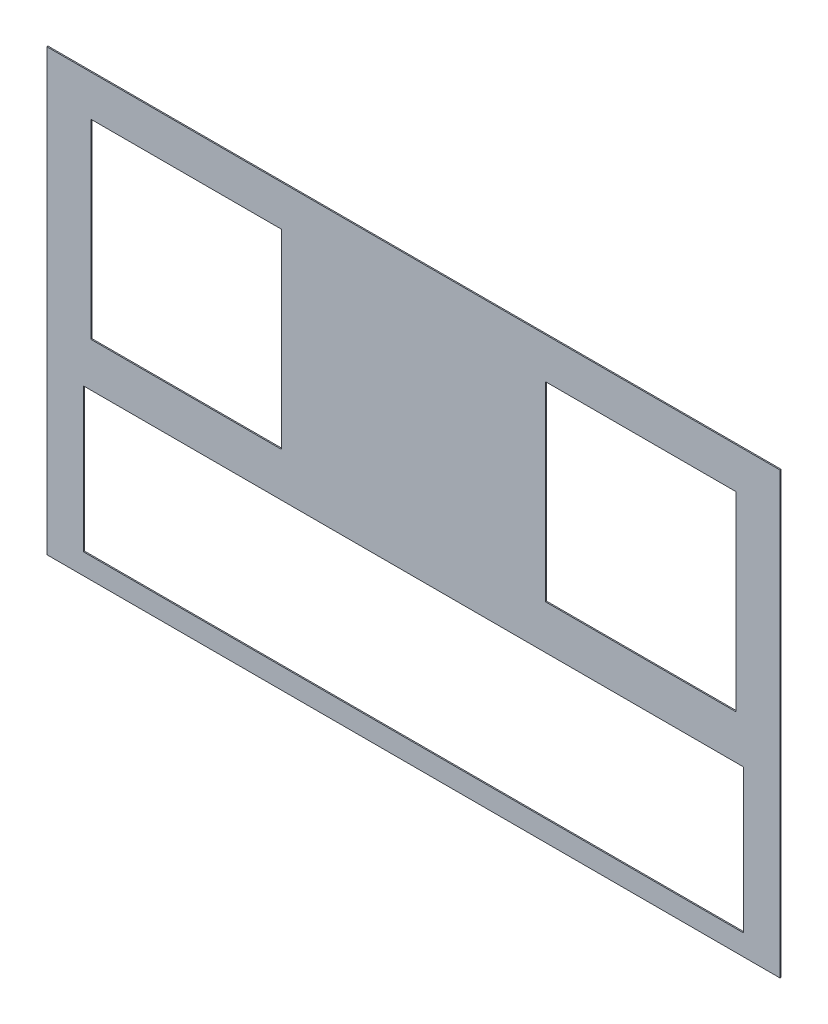
ISO-10303-21;
HEADER;
FILE_DESCRIPTION(('STEP AP214'),'2;1');
FILE_NAME('part.step','',(''),(''),'','','');
FILE_SCHEMA(('AUTOMOTIVE_DESIGN { 1 0 10303 214 1 1 1 1 }'));
ENDSEC;
DATA;
#1=APPLICATION_CONTEXT('core data for automotive mechanical design processes');
#2=APPLICATION_PROTOCOL_DEFINITION('international standard','automotive_design',2000,#1);
#3=PRODUCT_CONTEXT('',#1,'mechanical');
#4=PRODUCT('Part','Part','',(#3));
#5=PRODUCT_RELATED_PRODUCT_CATEGORY('part','',(#4));
#6=PRODUCT_DEFINITION_FORMATION('','',#4);
#7=PRODUCT_DEFINITION_CONTEXT('part definition',#1,'design');
#8=PRODUCT_DEFINITION('design','',#6,#7);
#9=PRODUCT_DEFINITION_SHAPE('','',#8);
#10=(LENGTH_UNIT() NAMED_UNIT(*) SI_UNIT(.MILLI.,.METRE.));
#11=(NAMED_UNIT(*) PLANE_ANGLE_UNIT() SI_UNIT($,.RADIAN.));
#12=(NAMED_UNIT(*) SI_UNIT($,.STERADIAN.) SOLID_ANGLE_UNIT());
#13=UNCERTAINTY_MEASURE_WITH_UNIT(LENGTH_MEASURE(1.E-05),#10,'distance_accuracy_value','');
#14=(GEOMETRIC_REPRESENTATION_CONTEXT(3) GLOBAL_UNCERTAINTY_ASSIGNED_CONTEXT((#13)) GLOBAL_UNIT_ASSIGNED_CONTEXT((#10,
#11,#12)) REPRESENTATION_CONTEXT('',''));
#15=CARTESIAN_POINT('',(0.,0.,0.));
#16=DIRECTION('',(0.,0.,1.));
#17=DIRECTION('',(1.,0.,0.));
#18=AXIS2_PLACEMENT_3D('',#15,#16,#17);
#19=CARTESIAN_POINT('',(-1250.,750.,4.));
#20=DIRECTION('',(1.,0.,0.));
#21=DIRECTION('',(0.,0.,-1.));
#22=AXIS2_PLACEMENT_3D('',#19,#20,#21);
#23=PLANE('',#22);
#24=DIRECTION('',(0.,-1.,0.));
#25=VECTOR('',#24,1.);
#26=CARTESIAN_POINT('',(-1250.,750.,0.));
#27=LINE('',#26,#25);
#28=CARTESIAN_POINT('',(-1250.,750.,0.));
#29=VERTEX_POINT('',#28);
#30=CARTESIAN_POINT('',(-1250.,-750.,0.));
#31=VERTEX_POINT('',#30);
#32=EDGE_CURVE('E240',#29,#31,#27,.T.);
#33=ORIENTED_EDGE('',*,*,#32,.T.);
#34=DIRECTION('',(0.,0.,-1.));
#35=VECTOR('',#34,1.);
#36=CARTESIAN_POINT('',(-1250.,-750.,4.));
#37=LINE('',#36,#35);
#38=CARTESIAN_POINT('',(-1250.,-750.,4.));
#39=VERTEX_POINT('',#38);
#40=EDGE_CURVE('E11',#39,#31,#37,.T.);
#41=ORIENTED_EDGE('',*,*,#40,.F.);
#42=DIRECTION('',(0.,-1.,0.));
#43=VECTOR('',#42,1.);
#44=CARTESIAN_POINT('',(-1250.,750.,4.));
#45=LINE('',#44,#43);
#46=CARTESIAN_POINT('',(-1250.,750.,4.));
#47=VERTEX_POINT('',#46);
#48=EDGE_CURVE('E247',#47,#39,#45,.T.);
#49=ORIENTED_EDGE('',*,*,#48,.F.);
#50=DIRECTION('',(0.,0.,-1.));
#51=VECTOR('',#50,1.);
#52=CARTESIAN_POINT('',(-1250.,750.,4.));
#53=LINE('',#52,#51);
#54=EDGE_CURVE('E257',#47,#29,#53,.T.);
#55=ORIENTED_EDGE('',*,*,#54,.T.);
#56=EDGE_LOOP('',(#33,#41,#49,#55));
#57=FACE_BOUND('',#56,.T.);
#58=ADVANCED_FACE('F34',(#57),#23,.F.);
#59=CARTESIAN_POINT('',(-1250.,-750.,4.));
#60=DIRECTION('',(0.,1.,0.));
#61=DIRECTION('',(0.,0.,1.));
#62=AXIS2_PLACEMENT_3D('',#59,#60,#61);
#63=PLANE('',#62);
#64=DIRECTION('',(1.,0.,0.));
#65=VECTOR('',#64,1.);
#66=CARTESIAN_POINT('',(-1250.,-750.,0.));
#67=LINE('',#66,#65);
#68=CARTESIAN_POINT('',(1250.,-750.,0.));
#69=VERTEX_POINT('',#68);
#70=EDGE_CURVE('E260',#31,#69,#67,.T.);
#71=ORIENTED_EDGE('',*,*,#70,.T.);
#72=DIRECTION('',(0.,0.,-1.));
#73=VECTOR('',#72,1.);
#74=CARTESIAN_POINT('',(1250.,-750.,4.));
#75=LINE('',#74,#73);
#76=CARTESIAN_POINT('',(1250.,-750.,4.));
#77=VERTEX_POINT('',#76);
#78=EDGE_CURVE('E41',#77,#69,#75,.T.);
#79=ORIENTED_EDGE('',*,*,#78,.F.);
#80=DIRECTION('',(1.,0.,0.));
#81=VECTOR('',#80,1.);
#82=CARTESIAN_POINT('',(-1250.,-750.,4.));
#83=LINE('',#82,#81);
#84=EDGE_CURVE('E250',#39,#77,#83,.T.);
#85=ORIENTED_EDGE('',*,*,#84,.F.);
#86=ORIENTED_EDGE('',*,*,#40,.T.);
#87=EDGE_LOOP('',(#71,#79,#85,#86));
#88=FACE_BOUND('',#87,.T.);
#89=ADVANCED_FACE('F289',(#88),#63,.F.);
#90=CARTESIAN_POINT('',(1250.,750.,4.));
#91=DIRECTION('',(-1.,0.,0.));
#92=DIRECTION('',(0.,0.,1.));
#93=AXIS2_PLACEMENT_3D('',#90,#91,#92);
#94=PLANE('',#93);
#95=DIRECTION('',(0.,1.,0.));
#96=VECTOR('',#95,1.);
#97=CARTESIAN_POINT('',(1250.,750.,0.));
#98=LINE('',#97,#96);
#99=CARTESIAN_POINT('',(1250.,750.,0.));
#100=VERTEX_POINT('',#99);
#101=EDGE_CURVE('E262',#69,#100,#98,.T.);
#102=ORIENTED_EDGE('',*,*,#101,.T.);
#103=DIRECTION('',(0.,0.,-1.));
#104=VECTOR('',#103,1.);
#105=CARTESIAN_POINT('',(1250.,750.,4.));
#106=LINE('',#105,#104);
#107=CARTESIAN_POINT('',(1250.,750.,4.));
#108=VERTEX_POINT('',#107);
#109=EDGE_CURVE('E268',#108,#100,#106,.T.);
#110=ORIENTED_EDGE('',*,*,#109,.F.);
#111=DIRECTION('',(0.,1.,0.));
#112=VECTOR('',#111,1.);
#113=CARTESIAN_POINT('',(1250.,750.,4.));
#114=LINE('',#113,#112);
#115=EDGE_CURVE('E253',#77,#108,#114,.T.);
#116=ORIENTED_EDGE('',*,*,#115,.F.);
#117=ORIENTED_EDGE('',*,*,#78,.T.);
#118=EDGE_LOOP('',(#102,#110,#116,#117));
#119=FACE_BOUND('',#118,.T.);
#120=ADVANCED_FACE('F275',(#119),#94,.F.);
#121=CARTESIAN_POINT('',(-1250.,750.,4.));
#122=DIRECTION('',(0.,-1.,0.));
#123=DIRECTION('',(0.,0.,-1.));
#124=AXIS2_PLACEMENT_3D('',#121,#122,#123);
#125=PLANE('',#124);
#126=DIRECTION('',(-1.,0.,0.));
#127=VECTOR('',#126,1.);
#128=CARTESIAN_POINT('',(-1250.,750.,0.));
#129=LINE('',#128,#127);
#130=EDGE_CURVE('E251',#100,#29,#129,.T.);
#131=ORIENTED_EDGE('',*,*,#130,.T.);
#132=ORIENTED_EDGE('',*,*,#54,.F.);
#133=DIRECTION('',(-1.,0.,0.));
#134=VECTOR('',#133,1.);
#135=CARTESIAN_POINT('',(0.,750.,4.));
#136=LINE('',#135,#134);
#137=EDGE_CURVE('E255',#108,#47,#136,.T.);
#138=ORIENTED_EDGE('',*,*,#137,.F.);
#139=ORIENTED_EDGE('',*,*,#109,.T.);
#140=EDGE_LOOP('',(#131,#132,#138,#139));
#141=FACE_BOUND('',#140,.T.);
#142=ADVANCED_FACE('F282',(#141),#125,.F.);
#143=CARTESIAN_POINT('',(0.,0.,4.));
#144=DIRECTION('',(0.,0.,1.));
#145=DIRECTION('',(1.,0.,0.));
#146=AXIS2_PLACEMENT_3D('',#143,#144,#145);
#147=PLANE('',#146);
#148=DIRECTION('',(0.,-1.,0.));
#149=VECTOR('',#148,1.);
#150=CARTESIAN_POINT('',(-1125.,-189.,4.));
#151=LINE('',#150,#149);
#152=CARTESIAN_POINT('',(-1125.,-189.,4.));
#153=VERTEX_POINT('',#152);
#154=CARTESIAN_POINT('',(-1125.,-679.,4.));
#155=VERTEX_POINT('',#154);
#156=EDGE_CURVE('E48',#153,#155,#151,.T.);
#157=ORIENTED_EDGE('',*,*,#156,.F.);
#158=DIRECTION('',(-1.,0.,0.));
#159=VECTOR('',#158,1.);
#160=CARTESIAN_POINT('',(-1125.,-189.,4.));
#161=LINE('',#160,#159);
#162=CARTESIAN_POINT('',(1125.,-189.,4.));
#163=VERTEX_POINT('',#162);
#164=EDGE_CURVE('E164',#163,#153,#161,.T.);
#165=ORIENTED_EDGE('',*,*,#164,.F.);
#166=DIRECTION('',(0.,1.,0.));
#167=VECTOR('',#166,1.);
#168=CARTESIAN_POINT('',(1125.,-189.,4.));
#169=LINE('',#168,#167);
#170=CARTESIAN_POINT('',(1125.,-679.,4.));
#171=VERTEX_POINT('',#170);
#172=EDGE_CURVE('E167',#171,#163,#169,.T.);
#173=ORIENTED_EDGE('',*,*,#172,.F.);
#174=DIRECTION('',(1.,0.,0.));
#175=VECTOR('',#174,1.);
#176=CARTESIAN_POINT('',(-1125.,-679.,4.));
#177=LINE('',#176,#175);
#178=EDGE_CURVE('E173',#155,#171,#177,.T.);
#179=ORIENTED_EDGE('',*,*,#178,.F.);
#180=EDGE_LOOP('',(#157,#165,#173,#179));
#181=FACE_BOUND('',#180,.T.);
#182=DIRECTION('',(0.,-1.,0.));
#183=VECTOR('',#182,1.);
#184=CARTESIAN_POINT('',(450.,611.,4.));
#185=LINE('',#184,#183);
#186=CARTESIAN_POINT('',(450.,611.,4.));
#187=VERTEX_POINT('',#186);
#188=CARTESIAN_POINT('',(450.,-38.9999999999998,4.));
#189=VERTEX_POINT('',#188);
#190=EDGE_CURVE('E179',#187,#189,#185,.T.);
#191=ORIENTED_EDGE('',*,*,#190,.F.);
#192=DIRECTION('',(-1.,0.,0.));
#193=VECTOR('',#192,1.);
#194=CARTESIAN_POINT('',(450.,611.,4.));
#195=LINE('',#194,#193);
#196=CARTESIAN_POINT('',(1100.,611.,4.));
#197=VERTEX_POINT('',#196);
#198=EDGE_CURVE('E187',#197,#187,#195,.T.);
#199=ORIENTED_EDGE('',*,*,#198,.F.);
#200=DIRECTION('',(0.,1.,0.));
#201=VECTOR('',#200,1.);
#202=CARTESIAN_POINT('',(1100.,611.,4.));
#203=LINE('',#202,#201);
#204=CARTESIAN_POINT('',(1100.,-39.0000000000003,4.));
#205=VERTEX_POINT('',#204);
#206=EDGE_CURVE('E201',#205,#197,#203,.T.);
#207=ORIENTED_EDGE('',*,*,#206,.F.);
#208=DIRECTION('',(1.,0.,0.));
#209=VECTOR('',#208,1.);
#210=CARTESIAN_POINT('',(450.,-38.9999999999998,4.));
#211=LINE('',#210,#209);
#212=EDGE_CURVE('E198',#189,#205,#211,.T.);
#213=ORIENTED_EDGE('',*,*,#212,.F.);
#214=EDGE_LOOP('',(#191,#199,#207,#213));
#215=FACE_BOUND('',#214,.T.);
#216=DIRECTION('',(0.,-1.,0.));
#217=VECTOR('',#216,1.);
#218=CARTESIAN_POINT('',(-1100.,611.,4.));
#219=LINE('',#218,#217);
#220=CARTESIAN_POINT('',(-1100.,611.,4.));
#221=VERTEX_POINT('',#220);
#222=CARTESIAN_POINT('',(-1100.,-39.0000000000003,4.));
#223=VERTEX_POINT('',#222);
#224=EDGE_CURVE('E208',#221,#223,#219,.T.);
#225=ORIENTED_EDGE('',*,*,#224,.F.);
#226=DIRECTION('',(-1.,0.,0.));
#227=VECTOR('',#226,1.);
#228=CARTESIAN_POINT('',(-1100.,611.,4.));
#229=LINE('',#228,#227);
#230=CARTESIAN_POINT('',(-450.,610.999999999999,4.));
#231=VERTEX_POINT('',#230);
#232=EDGE_CURVE('E219',#231,#221,#229,.T.);
#233=ORIENTED_EDGE('',*,*,#232,.F.);
#234=DIRECTION('',(0.,1.,0.));
#235=VECTOR('',#234,1.);
#236=CARTESIAN_POINT('',(-450.,610.999999999999,4.));
#237=LINE('',#236,#235);
#238=CARTESIAN_POINT('',(-450.,-38.9999999999999,4.));
#239=VERTEX_POINT('',#238);
#240=EDGE_CURVE('E233',#239,#231,#237,.T.);
#241=ORIENTED_EDGE('',*,*,#240,.F.);
#242=DIRECTION('',(1.,0.,0.));
#243=VECTOR('',#242,1.);
#244=CARTESIAN_POINT('',(-1100.,-39.0000000000003,4.));
#245=LINE('',#244,#243);
#246=EDGE_CURVE('E230',#223,#239,#245,.T.);
#247=ORIENTED_EDGE('',*,*,#246,.F.);
#248=EDGE_LOOP('',(#225,#233,#241,#247));
#249=FACE_BOUND('',#248,.T.);
#250=ORIENTED_EDGE('',*,*,#48,.T.);
#251=ORIENTED_EDGE('',*,*,#84,.T.);
#252=ORIENTED_EDGE('',*,*,#115,.T.);
#253=ORIENTED_EDGE('',*,*,#137,.T.);
#254=EDGE_LOOP('',(#250,#251,#252,#253));
#255=FACE_BOUND('',#254,.T.);
#256=ADVANCED_FACE('F288',(#181,#215,#249,#255),#147,.T.);
#257=CARTESIAN_POINT('',(0.,0.,0.));
#258=DIRECTION('',(0.,0.,1.));
#259=DIRECTION('',(1.,0.,0.));
#260=AXIS2_PLACEMENT_3D('',#257,#258,#259);
#261=PLANE('',#260);
#262=DIRECTION('',(-1.,0.,0.));
#263=VECTOR('',#262,1.);
#264=CARTESIAN_POINT('',(-1125.,-189.,0.));
#265=LINE('',#264,#263);
#266=CARTESIAN_POINT('',(1125.,-189.,0.));
#267=VERTEX_POINT('',#266);
#268=CARTESIAN_POINT('',(-1125.,-189.,0.));
#269=VERTEX_POINT('',#268);
#270=EDGE_CURVE('E154',#267,#269,#265,.T.);
#271=ORIENTED_EDGE('',*,*,#270,.T.);
#272=DIRECTION('',(0.,-1.,0.));
#273=VECTOR('',#272,1.);
#274=CARTESIAN_POINT('',(-1125.,-189.,0.));
#275=LINE('',#274,#273);
#276=CARTESIAN_POINT('',(-1125.,-679.,0.));
#277=VERTEX_POINT('',#276);
#278=EDGE_CURVE('E148',#269,#277,#275,.T.);
#279=ORIENTED_EDGE('',*,*,#278,.T.);
#280=DIRECTION('',(1.,0.,0.));
#281=VECTOR('',#280,1.);
#282=CARTESIAN_POINT('',(-1125.,-679.,0.));
#283=LINE('',#282,#281);
#284=CARTESIAN_POINT('',(1125.,-679.,0.));
#285=VERTEX_POINT('',#284);
#286=EDGE_CURVE('E157',#277,#285,#283,.T.);
#287=ORIENTED_EDGE('',*,*,#286,.T.);
#288=DIRECTION('',(0.,1.,0.));
#289=VECTOR('',#288,1.);
#290=CARTESIAN_POINT('',(1125.,-189.,0.));
#291=LINE('',#290,#289);
#292=EDGE_CURVE('E56',#285,#267,#291,.T.);
#293=ORIENTED_EDGE('',*,*,#292,.T.);
#294=EDGE_LOOP('',(#271,#279,#287,#293));
#295=FACE_BOUND('',#294,.T.);
#296=DIRECTION('',(-1.,0.,0.));
#297=VECTOR('',#296,1.);
#298=CARTESIAN_POINT('',(450.,611.,0.));
#299=LINE('',#298,#297);
#300=CARTESIAN_POINT('',(1100.,611.,0.));
#301=VERTEX_POINT('',#300);
#302=CARTESIAN_POINT('',(450.,611.,0.));
#303=VERTEX_POINT('',#302);
#304=EDGE_CURVE('E193',#301,#303,#299,.T.);
#305=ORIENTED_EDGE('',*,*,#304,.T.);
#306=DIRECTION('',(0.,-1.,0.));
#307=VECTOR('',#306,1.);
#308=CARTESIAN_POINT('',(450.,611.,0.));
#309=LINE('',#308,#307);
#310=CARTESIAN_POINT('',(450.,-38.9999999999998,0.));
#311=VERTEX_POINT('',#310);
#312=EDGE_CURVE('E183',#303,#311,#309,.T.);
#313=ORIENTED_EDGE('',*,*,#312,.T.);
#314=DIRECTION('',(1.,0.,0.));
#315=VECTOR('',#314,1.);
#316=CARTESIAN_POINT('',(450.,-38.9999999999998,0.));
#317=LINE('',#316,#315);
#318=CARTESIAN_POINT('',(1100.,-39.0000000000003,0.));
#319=VERTEX_POINT('',#318);
#320=EDGE_CURVE('E186',#311,#319,#317,.T.);
#321=ORIENTED_EDGE('',*,*,#320,.T.);
#322=DIRECTION('',(0.,1.,0.));
#323=VECTOR('',#322,1.);
#324=CARTESIAN_POINT('',(1100.,611.,0.));
#325=LINE('',#324,#323);
#326=EDGE_CURVE('E190',#319,#301,#325,.T.);
#327=ORIENTED_EDGE('',*,*,#326,.T.);
#328=EDGE_LOOP('',(#305,#313,#321,#327));
#329=FACE_BOUND('',#328,.T.);
#330=DIRECTION('',(-1.,0.,0.));
#331=VECTOR('',#330,1.);
#332=CARTESIAN_POINT('',(-1100.,611.,0.));
#333=LINE('',#332,#331);
#334=CARTESIAN_POINT('',(-450.,610.999999999999,0.));
#335=VERTEX_POINT('',#334);
#336=CARTESIAN_POINT('',(-1100.,611.,0.));
#337=VERTEX_POINT('',#336);
#338=EDGE_CURVE('E225',#335,#337,#333,.T.);
#339=ORIENTED_EDGE('',*,*,#338,.T.);
#340=DIRECTION('',(0.,-1.,0.));
#341=VECTOR('',#340,1.);
#342=CARTESIAN_POINT('',(-1100.,611.,0.));
#343=LINE('',#342,#341);
#344=CARTESIAN_POINT('',(-1100.,-39.0000000000003,0.));
#345=VERTEX_POINT('',#344);
#346=EDGE_CURVE('E215',#337,#345,#343,.T.);
#347=ORIENTED_EDGE('',*,*,#346,.T.);
#348=DIRECTION('',(1.,0.,0.));
#349=VECTOR('',#348,1.);
#350=CARTESIAN_POINT('',(-1100.,-39.0000000000003,0.));
#351=LINE('',#350,#349);
#352=CARTESIAN_POINT('',(-450.,-38.9999999999999,0.));
#353=VERTEX_POINT('',#352);
#354=EDGE_CURVE('E218',#345,#353,#351,.T.);
#355=ORIENTED_EDGE('',*,*,#354,.T.);
#356=DIRECTION('',(0.,1.,0.));
#357=VECTOR('',#356,1.);
#358=CARTESIAN_POINT('',(-450.,610.999999999999,0.));
#359=LINE('',#358,#357);
#360=EDGE_CURVE('E222',#353,#335,#359,.T.);
#361=ORIENTED_EDGE('',*,*,#360,.T.);
#362=EDGE_LOOP('',(#339,#347,#355,#361));
#363=FACE_BOUND('',#362,.T.);
#364=ORIENTED_EDGE('',*,*,#32,.F.);
#365=ORIENTED_EDGE('',*,*,#130,.F.);
#366=ORIENTED_EDGE('',*,*,#101,.F.);
#367=ORIENTED_EDGE('',*,*,#70,.F.);
#368=EDGE_LOOP('',(#364,#365,#366,#367));
#369=FACE_BOUND('',#368,.T.);
#370=ADVANCED_FACE('F161',(#295,#329,#363,#369),#261,.F.);
#371=CARTESIAN_POINT('',(-1100.,611.,0.));
#372=DIRECTION('',(-1.,0.,0.));
#373=DIRECTION('',(0.,0.,1.));
#374=AXIS2_PLACEMENT_3D('',#371,#372,#373);
#375=PLANE('',#374);
#376=ORIENTED_EDGE('',*,*,#224,.T.);
#377=DIRECTION('',(0.,0.,1.));
#378=VECTOR('',#377,1.);
#379=CARTESIAN_POINT('',(-1100.,-39.0000000000003,0.));
#380=LINE('',#379,#378);
#381=EDGE_CURVE('E228',#345,#223,#380,.T.);
#382=ORIENTED_EDGE('',*,*,#381,.F.);
#383=ORIENTED_EDGE('',*,*,#346,.F.);
#384=DIRECTION('',(0.,0.,1.));
#385=VECTOR('',#384,1.);
#386=CARTESIAN_POINT('',(-1100.,611.,0.));
#387=LINE('',#386,#385);
#388=EDGE_CURVE('E238',#337,#221,#387,.T.);
#389=ORIENTED_EDGE('',*,*,#388,.T.);
#390=EDGE_LOOP('',(#376,#382,#383,#389));
#391=FACE_BOUND('',#390,.T.);
#392=ADVANCED_FACE('F301',(#391),#375,.F.);
#393=CARTESIAN_POINT('',(-1100.,611.,0.));
#394=DIRECTION('',(0.,1.,0.));
#395=DIRECTION('',(-1.,0.,0.));
#396=AXIS2_PLACEMENT_3D('',#393,#394,#395);
#397=PLANE('',#396);
#398=ORIENTED_EDGE('',*,*,#232,.T.);
#399=ORIENTED_EDGE('',*,*,#388,.F.);
#400=ORIENTED_EDGE('',*,*,#338,.F.);
#401=DIRECTION('',(0.,0.,1.));
#402=VECTOR('',#401,1.);
#403=CARTESIAN_POINT('',(-450.,610.999999999999,0.));
#404=LINE('',#403,#402);
#405=EDGE_CURVE('E241',#335,#231,#404,.T.);
#406=ORIENTED_EDGE('',*,*,#405,.T.);
#407=EDGE_LOOP('',(#398,#399,#400,#406));
#408=FACE_BOUND('',#407,.T.);
#409=ADVANCED_FACE('F307',(#408),#397,.F.);
#410=CARTESIAN_POINT('',(-450.,610.999999999999,0.));
#411=DIRECTION('',(1.,0.,0.));
#412=DIRECTION('',(0.,1.,0.));
#413=AXIS2_PLACEMENT_3D('',#410,#411,#412);
#414=PLANE('',#413);
#415=ORIENTED_EDGE('',*,*,#240,.T.);
#416=ORIENTED_EDGE('',*,*,#405,.F.);
#417=ORIENTED_EDGE('',*,*,#360,.F.);
#418=DIRECTION('',(0.,0.,1.));
#419=VECTOR('',#418,1.);
#420=CARTESIAN_POINT('',(-450.,-38.9999999999999,0.));
#421=LINE('',#420,#419);
#422=EDGE_CURVE('E243',#353,#239,#421,.T.);
#423=ORIENTED_EDGE('',*,*,#422,.T.);
#424=EDGE_LOOP('',(#415,#416,#417,#423));
#425=FACE_BOUND('',#424,.T.);
#426=ADVANCED_FACE('F313',(#425),#414,.F.);
#427=CARTESIAN_POINT('',(-1100.,-39.0000000000003,0.));
#428=DIRECTION('',(0.,-1.,0.));
#429=DIRECTION('',(1.,0.,0.));
#430=AXIS2_PLACEMENT_3D('',#427,#428,#429);
#431=PLANE('',#430);
#432=ORIENTED_EDGE('',*,*,#246,.T.);
#433=ORIENTED_EDGE('',*,*,#422,.F.);
#434=ORIENTED_EDGE('',*,*,#354,.F.);
#435=ORIENTED_EDGE('',*,*,#381,.T.);
#436=EDGE_LOOP('',(#432,#433,#434,#435));
#437=FACE_BOUND('',#436,.T.);
#438=ADVANCED_FACE('F309',(#437),#431,.F.);
#439=CARTESIAN_POINT('',(450.,611.,0.));
#440=DIRECTION('',(-1.,0.,0.));
#441=DIRECTION('',(0.,0.,1.));
#442=AXIS2_PLACEMENT_3D('',#439,#440,#441);
#443=PLANE('',#442);
#444=ORIENTED_EDGE('',*,*,#190,.T.);
#445=DIRECTION('',(0.,0.,1.));
#446=VECTOR('',#445,1.);
#447=CARTESIAN_POINT('',(450.,-38.9999999999998,0.));
#448=LINE('',#447,#446);
#449=EDGE_CURVE('E196',#311,#189,#448,.T.);
#450=ORIENTED_EDGE('',*,*,#449,.F.);
#451=ORIENTED_EDGE('',*,*,#312,.F.);
#452=DIRECTION('',(0.,0.,1.));
#453=VECTOR('',#452,1.);
#454=CARTESIAN_POINT('',(450.,611.,0.));
#455=LINE('',#454,#453);
#456=EDGE_CURVE('E206',#303,#187,#455,.T.);
#457=ORIENTED_EDGE('',*,*,#456,.T.);
#458=EDGE_LOOP('',(#444,#450,#451,#457));
#459=FACE_BOUND('',#458,.T.);
#460=ADVANCED_FACE('F312',(#459),#443,.F.);
#461=CARTESIAN_POINT('',(450.,611.,0.));
#462=DIRECTION('',(0.,1.,0.));
#463=DIRECTION('',(-1.,0.,0.));
#464=AXIS2_PLACEMENT_3D('',#461,#462,#463);
#465=PLANE('',#464);
#466=ORIENTED_EDGE('',*,*,#198,.T.);
#467=ORIENTED_EDGE('',*,*,#456,.F.);
#468=ORIENTED_EDGE('',*,*,#304,.F.);
#469=DIRECTION('',(0.,0.,1.));
#470=VECTOR('',#469,1.);
#471=CARTESIAN_POINT('',(1100.,611.,0.));
#472=LINE('',#471,#470);
#473=EDGE_CURVE('E209',#301,#197,#472,.T.);
#474=ORIENTED_EDGE('',*,*,#473,.T.);
#475=EDGE_LOOP('',(#466,#467,#468,#474));
#476=FACE_BOUND('',#475,.T.);
#477=ADVANCED_FACE('F323',(#476),#465,.F.);
#478=CARTESIAN_POINT('',(1100.,611.,0.));
#479=DIRECTION('',(1.,0.,0.));
#480=DIRECTION('',(0.,0.,-1.));
#481=AXIS2_PLACEMENT_3D('',#478,#479,#480);
#482=PLANE('',#481);
#483=ORIENTED_EDGE('',*,*,#206,.T.);
#484=ORIENTED_EDGE('',*,*,#473,.F.);
#485=ORIENTED_EDGE('',*,*,#326,.F.);
#486=DIRECTION('',(0.,0.,1.));
#487=VECTOR('',#486,1.);
#488=CARTESIAN_POINT('',(1100.,-39.0000000000003,0.));
#489=LINE('',#488,#487);
#490=EDGE_CURVE('E211',#319,#205,#489,.T.);
#491=ORIENTED_EDGE('',*,*,#490,.T.);
#492=EDGE_LOOP('',(#483,#484,#485,#491));
#493=FACE_BOUND('',#492,.T.);
#494=ADVANCED_FACE('F328',(#493),#482,.F.);
#495=CARTESIAN_POINT('',(450.,-38.9999999999998,0.));
#496=DIRECTION('',(0.,-1.,0.));
#497=DIRECTION('',(1.,0.,0.));
#498=AXIS2_PLACEMENT_3D('',#495,#496,#497);
#499=PLANE('',#498);
#500=ORIENTED_EDGE('',*,*,#212,.T.);
#501=ORIENTED_EDGE('',*,*,#490,.F.);
#502=ORIENTED_EDGE('',*,*,#320,.F.);
#503=ORIENTED_EDGE('',*,*,#449,.T.);
#504=EDGE_LOOP('',(#500,#501,#502,#503));
#505=FACE_BOUND('',#504,.T.);
#506=ADVANCED_FACE('F325',(#505),#499,.F.);
#507=CARTESIAN_POINT('',(-1125.,-189.,0.));
#508=DIRECTION('',(-1.,0.,0.));
#509=DIRECTION('',(0.,0.,1.));
#510=AXIS2_PLACEMENT_3D('',#507,#508,#509);
#511=PLANE('',#510);
#512=ORIENTED_EDGE('',*,*,#156,.T.);
#513=DIRECTION('',(0.,0.,1.));
#514=VECTOR('',#513,1.);
#515=CARTESIAN_POINT('',(-1125.,-679.,0.));
#516=LINE('',#515,#514);
#517=EDGE_CURVE('E144',#277,#155,#516,.T.);
#518=ORIENTED_EDGE('',*,*,#517,.F.);
#519=ORIENTED_EDGE('',*,*,#278,.F.);
#520=DIRECTION('',(0.,0.,1.));
#521=VECTOR('',#520,1.);
#522=CARTESIAN_POINT('',(-1125.,-189.,0.));
#523=LINE('',#522,#521);
#524=EDGE_CURVE('E177',#269,#153,#523,.T.);
#525=ORIENTED_EDGE('',*,*,#524,.T.);
#526=EDGE_LOOP('',(#512,#518,#519,#525));
#527=FACE_BOUND('',#526,.T.);
#528=ADVANCED_FACE('F146',(#527),#511,.F.);
#529=CARTESIAN_POINT('',(-1125.,-189.,0.));
#530=DIRECTION('',(0.,1.,0.));
#531=DIRECTION('',(0.,0.,1.));
#532=AXIS2_PLACEMENT_3D('',#529,#530,#531);
#533=PLANE('',#532);
#534=ORIENTED_EDGE('',*,*,#164,.T.);
#535=ORIENTED_EDGE('',*,*,#524,.F.);
#536=ORIENTED_EDGE('',*,*,#270,.F.);
#537=DIRECTION('',(0.,0.,1.));
#538=VECTOR('',#537,1.);
#539=CARTESIAN_POINT('',(1125.,-189.,0.));
#540=LINE('',#539,#538);
#541=EDGE_CURVE('E180',#267,#163,#540,.T.);
#542=ORIENTED_EDGE('',*,*,#541,.T.);
#543=EDGE_LOOP('',(#534,#535,#536,#542));
#544=FACE_BOUND('',#543,.T.);
#545=ADVANCED_FACE('F338',(#544),#533,.F.);
#546=CARTESIAN_POINT('',(1125.,-189.,0.));
#547=DIRECTION('',(1.,0.,0.));
#548=DIRECTION('',(0.,0.,-1.));
#549=AXIS2_PLACEMENT_3D('',#546,#547,#548);
#550=PLANE('',#549);
#551=ORIENTED_EDGE('',*,*,#172,.T.);
#552=ORIENTED_EDGE('',*,*,#541,.F.);
#553=ORIENTED_EDGE('',*,*,#292,.F.);
#554=DIRECTION('',(0.,0.,1.));
#555=VECTOR('',#554,1.);
#556=CARTESIAN_POINT('',(1125.,-679.,0.));
#557=LINE('',#556,#555);
#558=EDGE_CURVE('E153',#285,#171,#557,.T.);
#559=ORIENTED_EDGE('',*,*,#558,.T.);
#560=EDGE_LOOP('',(#551,#552,#553,#559));
#561=FACE_BOUND('',#560,.T.);
#562=ADVANCED_FACE('F341',(#561),#550,.F.);
#563=CARTESIAN_POINT('',(-1125.,-679.,0.));
#564=DIRECTION('',(0.,-1.,0.));
#565=DIRECTION('',(0.,0.,-1.));
#566=AXIS2_PLACEMENT_3D('',#563,#564,#565);
#567=PLANE('',#566);
#568=ORIENTED_EDGE('',*,*,#178,.T.);
#569=ORIENTED_EDGE('',*,*,#558,.F.);
#570=ORIENTED_EDGE('',*,*,#286,.F.);
#571=ORIENTED_EDGE('',*,*,#517,.T.);
#572=EDGE_LOOP('',(#568,#569,#570,#571));
#573=FACE_BOUND('',#572,.T.);
#574=ADVANCED_FACE('F158',(#573),#567,.F.);
#575=CLOSED_SHELL('',(#58,#89,#120,#142,#256,#370,#392,#409,#426,#438,#460,#477,#494,#506,#528,
#545,#562,#574));
#576=MANIFOLD_SOLID_BREP('B2',#575);
#577=ADVANCED_BREP_SHAPE_REPRESENTATION('',(#18,#576),#14);
#578=SHAPE_DEFINITION_REPRESENTATION(#9,#577);
ENDSEC;
END-ISO-10303-21;
